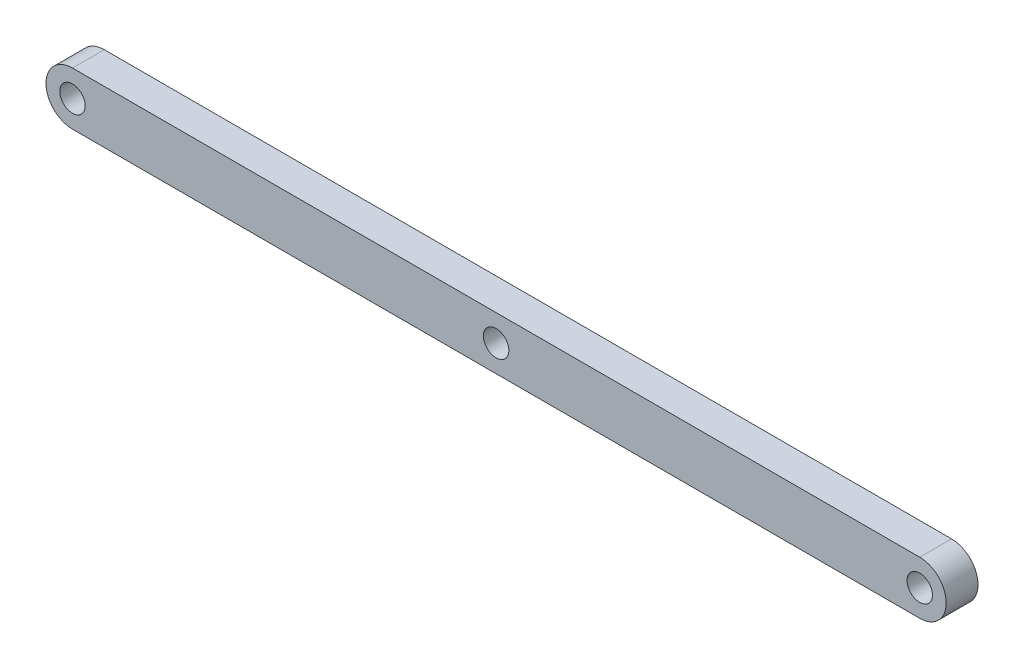
ISO-10303-21;
HEADER;
FILE_DESCRIPTION(('STEP AP214'),'2;1');
FILE_NAME('part.step','',(''),(''),'','','');
FILE_SCHEMA(('AUTOMOTIVE_DESIGN { 1 0 10303 214 1 1 1 1 }'));
ENDSEC;
DATA;
#1=APPLICATION_CONTEXT('core data for automotive mechanical design processes');
#2=APPLICATION_PROTOCOL_DEFINITION('international standard','automotive_design',2000,#1);
#3=PRODUCT_CONTEXT('',#1,'mechanical');
#4=PRODUCT('Part','Part','',(#3));
#5=PRODUCT_RELATED_PRODUCT_CATEGORY('part','',(#4));
#6=PRODUCT_DEFINITION_FORMATION('','',#4);
#7=PRODUCT_DEFINITION_CONTEXT('part definition',#1,'design');
#8=PRODUCT_DEFINITION('design','',#6,#7);
#9=PRODUCT_DEFINITION_SHAPE('','',#8);
#10=(LENGTH_UNIT() NAMED_UNIT(*) SI_UNIT(.MILLI.,.METRE.));
#11=(NAMED_UNIT(*) PLANE_ANGLE_UNIT() SI_UNIT($,.RADIAN.));
#12=(NAMED_UNIT(*) SI_UNIT($,.STERADIAN.) SOLID_ANGLE_UNIT());
#13=UNCERTAINTY_MEASURE_WITH_UNIT(LENGTH_MEASURE(1.E-05),#10,'distance_accuracy_value','');
#14=(GEOMETRIC_REPRESENTATION_CONTEXT(3) GLOBAL_UNCERTAINTY_ASSIGNED_CONTEXT((#13)) GLOBAL_UNIT_ASSIGNED_CONTEXT((#10,
#11,#12)) REPRESENTATION_CONTEXT('',''));
#15=CARTESIAN_POINT('',(0.,0.,0.));
#16=DIRECTION('',(0.,0.,1.));
#17=DIRECTION('',(1.,0.,0.));
#18=AXIS2_PLACEMENT_3D('',#15,#16,#17);
#19=CARTESIAN_POINT('',(0.,0.,30.));
#20=DIRECTION('',(0.,0.,-1.));
#21=DIRECTION('',(-1.,0.,0.));
#22=AXIS2_PLACEMENT_3D('',#19,#20,#21);
#23=CYLINDRICAL_SURFACE('',#22,25.);
#24=CARTESIAN_POINT('',(0.,0.,0.));
#25=DIRECTION('',(0.,0.,1.));
#26=DIRECTION('',(1.,0.,0.));
#27=AXIS2_PLACEMENT_3D('',#24,#25,#26);
#28=CIRCLE('',#27,25.);
#29=CARTESIAN_POINT('',(0.,25.,0.));
#30=VERTEX_POINT('',#29);
#31=CARTESIAN_POINT('',(0.,-25.,0.));
#32=VERTEX_POINT('',#31);
#33=EDGE_CURVE('E110',#30,#32,#28,.T.);
#34=ORIENTED_EDGE('',*,*,#33,.T.);
#35=DIRECTION('',(0.,0.,-1.));
#36=VECTOR('',#35,1.);
#37=CARTESIAN_POINT('',(0.,-25.,30.));
#38=LINE('',#37,#36);
#39=CARTESIAN_POINT('',(0.,-25.,30.));
#40=VERTEX_POINT('',#39);
#41=EDGE_CURVE('E11',#40,#32,#38,.T.);
#42=ORIENTED_EDGE('',*,*,#41,.F.);
#43=CARTESIAN_POINT('',(0.,0.,30.));
#44=DIRECTION('',(0.,0.,1.));
#45=DIRECTION('',(1.,0.,0.));
#46=AXIS2_PLACEMENT_3D('',#43,#44,#45);
#47=CIRCLE('',#46,25.);
#48=CARTESIAN_POINT('',(0.,25.,30.));
#49=VERTEX_POINT('',#48);
#50=EDGE_CURVE('E92',#49,#40,#47,.T.);
#51=ORIENTED_EDGE('',*,*,#50,.F.);
#52=DIRECTION('',(0.,0.,-1.));
#53=VECTOR('',#52,1.);
#54=CARTESIAN_POINT('',(0.,25.,30.));
#55=LINE('',#54,#53);
#56=EDGE_CURVE('E59',#49,#30,#55,.T.);
#57=ORIENTED_EDGE('',*,*,#56,.T.);
#58=EDGE_LOOP('',(#34,#42,#51,#57));
#59=FACE_BOUND('',#58,.T.);
#60=ADVANCED_FACE('F42',(#59),#23,.T.);
#61=CARTESIAN_POINT('',(0.,-25.,30.));
#62=DIRECTION('',(0.,1.,0.));
#63=DIRECTION('',(0.,0.,1.));
#64=AXIS2_PLACEMENT_3D('',#61,#62,#63);
#65=PLANE('',#64);
#66=DIRECTION('',(1.,0.,0.));
#67=VECTOR('',#66,1.);
#68=CARTESIAN_POINT('',(0.,-25.,0.));
#69=LINE('',#68,#67);
#70=CARTESIAN_POINT('',(800.,-25.,0.));
#71=VERTEX_POINT('',#70);
#72=EDGE_CURVE('E98',#32,#71,#69,.T.);
#73=ORIENTED_EDGE('',*,*,#72,.T.);
#74=DIRECTION('',(0.,0.,-1.));
#75=VECTOR('',#74,1.);
#76=CARTESIAN_POINT('',(800.,-25.,30.));
#77=LINE('',#76,#75);
#78=CARTESIAN_POINT('',(800.,-25.,30.));
#79=VERTEX_POINT('',#78);
#80=EDGE_CURVE('E51',#79,#71,#77,.T.);
#81=ORIENTED_EDGE('',*,*,#80,.F.);
#82=DIRECTION('',(1.,0.,0.));
#83=VECTOR('',#82,1.);
#84=CARTESIAN_POINT('',(0.,-25.,30.));
#85=LINE('',#84,#83);
#86=EDGE_CURVE('E85',#40,#79,#85,.T.);
#87=ORIENTED_EDGE('',*,*,#86,.F.);
#88=ORIENTED_EDGE('',*,*,#41,.T.);
#89=EDGE_LOOP('',(#73,#81,#87,#88));
#90=FACE_BOUND('',#89,.T.);
#91=ADVANCED_FACE('F97',(#90),#65,.F.);
#92=CARTESIAN_POINT('',(800.,0.,30.));
#93=DIRECTION('',(0.,0.,-1.));
#94=DIRECTION('',(-1.,0.,0.));
#95=AXIS2_PLACEMENT_3D('',#92,#93,#94);
#96=CYLINDRICAL_SURFACE('',#95,25.);
#97=CARTESIAN_POINT('',(800.,0.,0.));
#98=DIRECTION('',(0.,0.,1.));
#99=DIRECTION('',(1.,0.,0.));
#100=AXIS2_PLACEMENT_3D('',#97,#98,#99);
#101=CIRCLE('',#100,25.);
#102=CARTESIAN_POINT('',(800.,25.,0.));
#103=VERTEX_POINT('',#102);
#104=EDGE_CURVE('E116',#71,#103,#101,.T.);
#105=ORIENTED_EDGE('',*,*,#104,.T.);
#106=DIRECTION('',(0.,0.,-1.));
#107=VECTOR('',#106,1.);
#108=CARTESIAN_POINT('',(800.,25.,30.));
#109=LINE('',#108,#107);
#110=CARTESIAN_POINT('',(800.,25.,30.));
#111=VERTEX_POINT('',#110);
#112=EDGE_CURVE('E74',#111,#103,#109,.T.);
#113=ORIENTED_EDGE('',*,*,#112,.F.);
#114=CARTESIAN_POINT('',(800.,0.,30.));
#115=DIRECTION('',(0.,0.,1.));
#116=DIRECTION('',(1.,0.,0.));
#117=AXIS2_PLACEMENT_3D('',#114,#115,#116);
#118=CIRCLE('',#117,25.);
#119=EDGE_CURVE('E91',#79,#111,#118,.T.);
#120=ORIENTED_EDGE('',*,*,#119,.F.);
#121=ORIENTED_EDGE('',*,*,#80,.T.);
#122=EDGE_LOOP('',(#105,#113,#120,#121));
#123=FACE_BOUND('',#122,.T.);
#124=ADVANCED_FACE('F102',(#123),#96,.T.);
#125=CARTESIAN_POINT('',(0.,25.,30.));
#126=DIRECTION('',(0.,1.,0.));
#127=DIRECTION('',(0.,0.,1.));
#128=AXIS2_PLACEMENT_3D('',#125,#126,#127);
#129=PLANE('',#128);
#130=DIRECTION('',(1.,0.,0.));
#131=VECTOR('',#130,1.);
#132=CARTESIAN_POINT('',(0.,25.,0.));
#133=LINE('',#132,#131);
#134=EDGE_CURVE('E119',#30,#103,#133,.T.);
#135=ORIENTED_EDGE('',*,*,#134,.F.);
#136=ORIENTED_EDGE('',*,*,#56,.F.);
#137=DIRECTION('',(1.,0.,0.));
#138=VECTOR('',#137,1.);
#139=CARTESIAN_POINT('',(0.,25.,30.));
#140=LINE('',#139,#138);
#141=EDGE_CURVE('E104',#49,#111,#140,.T.);
#142=ORIENTED_EDGE('',*,*,#141,.T.);
#143=ORIENTED_EDGE('',*,*,#112,.T.);
#144=EDGE_LOOP('',(#135,#136,#142,#143));
#145=FACE_BOUND('',#144,.T.);
#146=ADVANCED_FACE('F158',(#145),#129,.T.);
#147=CARTESIAN_POINT('',(0.,0.,30.));
#148=DIRECTION('',(0.,0.,1.));
#149=DIRECTION('',(1.,0.,0.));
#150=AXIS2_PLACEMENT_3D('',#147,#148,#149);
#151=PLANE('',#150);
#152=CARTESIAN_POINT('',(0.,0.,30.));
#153=DIRECTION('',(0.,0.,1.));
#154=DIRECTION('',(1.,0.,0.));
#155=AXIS2_PLACEMENT_3D('',#152,#153,#154);
#156=CIRCLE('',#155,12.);
#157=CARTESIAN_POINT('',(12.,0.,30.));
#158=VERTEX_POINT('',#157);
#159=EDGE_CURVE('E148',#158,#158,#156,.T.);
#160=ORIENTED_EDGE('',*,*,#159,.F.);
#161=EDGE_LOOP('',(#160));
#162=FACE_BOUND('',#161,.T.);
#163=CARTESIAN_POINT('',(800.,0.,30.));
#164=DIRECTION('',(0.,0.,1.));
#165=DIRECTION('',(1.,0.,0.));
#166=AXIS2_PLACEMENT_3D('',#163,#164,#165);
#167=CIRCLE('',#166,12.);
#168=CARTESIAN_POINT('',(812.,0.,30.));
#169=VERTEX_POINT('',#168);
#170=EDGE_CURVE('E140',#169,#169,#167,.T.);
#171=ORIENTED_EDGE('',*,*,#170,.F.);
#172=EDGE_LOOP('',(#171));
#173=FACE_BOUND('',#172,.T.);
#174=CARTESIAN_POINT('',(400.,0.,30.));
#175=DIRECTION('',(0.,0.,1.));
#176=DIRECTION('',(1.,0.,0.));
#177=AXIS2_PLACEMENT_3D('',#174,#175,#176);
#178=CIRCLE('',#177,12.);
#179=CARTESIAN_POINT('',(412.,0.,30.));
#180=VERTEX_POINT('',#179);
#181=EDGE_CURVE('E132',#180,#180,#178,.T.);
#182=ORIENTED_EDGE('',*,*,#181,.F.);
#183=EDGE_LOOP('',(#182));
#184=FACE_BOUND('',#183,.T.);
#185=ORIENTED_EDGE('',*,*,#50,.T.);
#186=ORIENTED_EDGE('',*,*,#86,.T.);
#187=ORIENTED_EDGE('',*,*,#119,.T.);
#188=ORIENTED_EDGE('',*,*,#141,.F.);
#189=EDGE_LOOP('',(#185,#186,#187,#188));
#190=FACE_BOUND('',#189,.T.);
#191=ADVANCED_FACE('F88',(#162,#173,#184,#190),#151,.T.);
#192=CARTESIAN_POINT('',(0.,0.,0.));
#193=DIRECTION('',(0.,0.,1.));
#194=DIRECTION('',(1.,0.,0.));
#195=AXIS2_PLACEMENT_3D('',#192,#193,#194);
#196=PLANE('',#195);
#197=CARTESIAN_POINT('',(0.,0.,0.));
#198=DIRECTION('',(0.,0.,1.));
#199=DIRECTION('',(1.,0.,0.));
#200=AXIS2_PLACEMENT_3D('',#197,#198,#199);
#201=CIRCLE('',#200,12.);
#202=CARTESIAN_POINT('',(12.,0.,0.));
#203=VERTEX_POINT('',#202);
#204=EDGE_CURVE('E144',#203,#203,#201,.T.);
#205=ORIENTED_EDGE('',*,*,#204,.T.);
#206=EDGE_LOOP('',(#205));
#207=FACE_BOUND('',#206,.T.);
#208=CARTESIAN_POINT('',(800.,0.,0.));
#209=DIRECTION('',(0.,0.,1.));
#210=DIRECTION('',(1.,0.,0.));
#211=AXIS2_PLACEMENT_3D('',#208,#209,#210);
#212=CIRCLE('',#211,12.);
#213=CARTESIAN_POINT('',(812.,0.,0.));
#214=VERTEX_POINT('',#213);
#215=EDGE_CURVE('E136',#214,#214,#212,.T.);
#216=ORIENTED_EDGE('',*,*,#215,.T.);
#217=EDGE_LOOP('',(#216));
#218=FACE_BOUND('',#217,.T.);
#219=CARTESIAN_POINT('',(400.,0.,0.));
#220=DIRECTION('',(0.,0.,1.));
#221=DIRECTION('',(1.,0.,0.));
#222=AXIS2_PLACEMENT_3D('',#219,#220,#221);
#223=CIRCLE('',#222,12.);
#224=CARTESIAN_POINT('',(412.,0.,0.));
#225=VERTEX_POINT('',#224);
#226=EDGE_CURVE('E113',#225,#225,#223,.T.);
#227=ORIENTED_EDGE('',*,*,#226,.T.);
#228=EDGE_LOOP('',(#227));
#229=FACE_BOUND('',#228,.T.);
#230=ORIENTED_EDGE('',*,*,#33,.F.);
#231=ORIENTED_EDGE('',*,*,#134,.T.);
#232=ORIENTED_EDGE('',*,*,#104,.F.);
#233=ORIENTED_EDGE('',*,*,#72,.F.);
#234=EDGE_LOOP('',(#230,#231,#232,#233));
#235=FACE_BOUND('',#234,.T.);
#236=ADVANCED_FACE('F157',(#207,#218,#229,#235),#196,.F.);
#237=CARTESIAN_POINT('',(400.,0.,30.));
#238=DIRECTION('',(0.,0.,1.));
#239=DIRECTION('',(1.,0.,0.));
#240=AXIS2_PLACEMENT_3D('',#237,#238,#239);
#241=CYLINDRICAL_SURFACE('',#240,12.);
#242=ORIENTED_EDGE('',*,*,#226,.F.);
#243=EDGE_LOOP('',(#242));
#244=FACE_BOUND('',#243,.T.);
#245=ORIENTED_EDGE('',*,*,#181,.T.);
#246=EDGE_LOOP('',(#245));
#247=FACE_BOUND('',#246,.T.);
#248=ADVANCED_FACE('F164',(#244,#247),#241,.F.);
#249=CARTESIAN_POINT('',(800.,0.,30.));
#250=DIRECTION('',(0.,0.,1.));
#251=DIRECTION('',(1.,0.,0.));
#252=AXIS2_PLACEMENT_3D('',#249,#250,#251);
#253=CYLINDRICAL_SURFACE('',#252,12.);
#254=ORIENTED_EDGE('',*,*,#215,.F.);
#255=EDGE_LOOP('',(#254));
#256=FACE_BOUND('',#255,.T.);
#257=ORIENTED_EDGE('',*,*,#170,.T.);
#258=EDGE_LOOP('',(#257));
#259=FACE_BOUND('',#258,.T.);
#260=ADVANCED_FACE('F166',(#256,#259),#253,.F.);
#261=CARTESIAN_POINT('',(0.,0.,30.));
#262=DIRECTION('',(0.,0.,1.));
#263=DIRECTION('',(1.,0.,0.));
#264=AXIS2_PLACEMENT_3D('',#261,#262,#263);
#265=CYLINDRICAL_SURFACE('',#264,12.);
#266=ORIENTED_EDGE('',*,*,#204,.F.);
#267=EDGE_LOOP('',(#266));
#268=FACE_BOUND('',#267,.T.);
#269=ORIENTED_EDGE('',*,*,#159,.T.);
#270=EDGE_LOOP('',(#269));
#271=FACE_BOUND('',#270,.T.);
#272=ADVANCED_FACE('F153',(#268,#271),#265,.F.);
#273=CLOSED_SHELL('',(#60,#91,#124,#146,#191,#236,#248,#260,#272));
#274=MANIFOLD_SOLID_BREP('B2',#273);
#275=ADVANCED_BREP_SHAPE_REPRESENTATION('',(#18,#274),#14);
#276=SHAPE_DEFINITION_REPRESENTATION(#9,#275);
ENDSEC;
END-ISO-10303-21;
